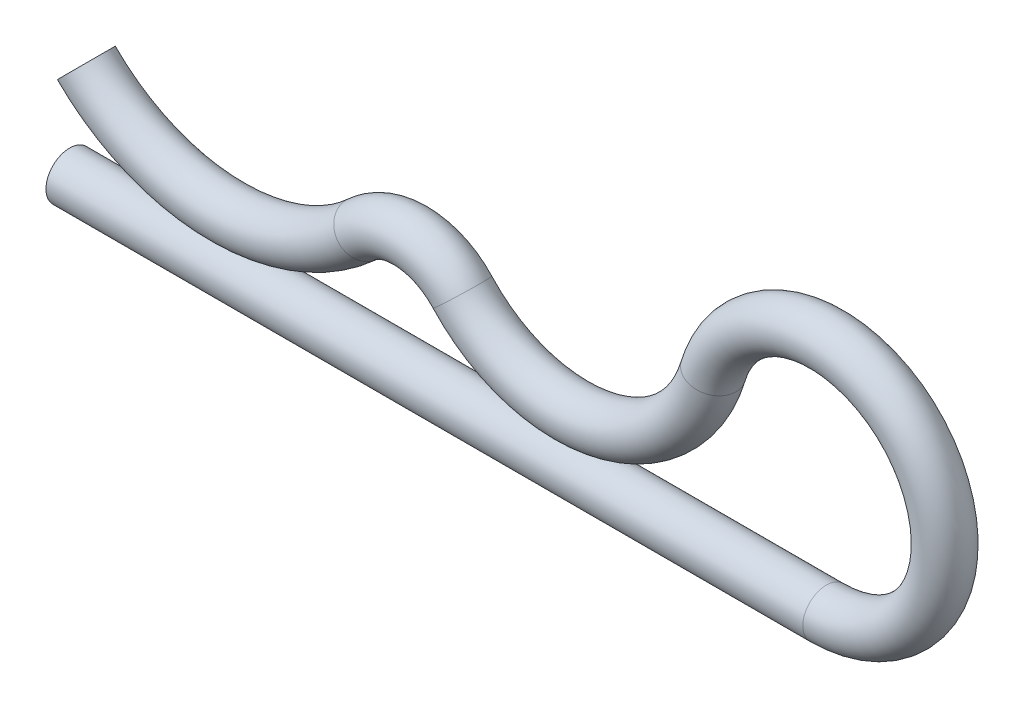
ISO-10303-21;
HEADER;
FILE_DESCRIPTION(('STEP AP214'),'2;1');
FILE_NAME('part.step','',(''),(''),'','','');
FILE_SCHEMA(('AUTOMOTIVE_DESIGN { 1 0 10303 214 1 1 1 1 }'));
ENDSEC;
DATA;
#1=APPLICATION_CONTEXT('core data for automotive mechanical design processes');
#2=APPLICATION_PROTOCOL_DEFINITION('international standard','automotive_design',2000,#1);
#3=PRODUCT_CONTEXT('',#1,'mechanical');
#4=PRODUCT('Part','Part','',(#3));
#5=PRODUCT_RELATED_PRODUCT_CATEGORY('part','',(#4));
#6=PRODUCT_DEFINITION_FORMATION('','',#4);
#7=PRODUCT_DEFINITION_CONTEXT('part definition',#1,'design');
#8=PRODUCT_DEFINITION('design','',#6,#7);
#9=PRODUCT_DEFINITION_SHAPE('','',#8);
#10=(LENGTH_UNIT() NAMED_UNIT(*) SI_UNIT(.MILLI.,.METRE.));
#11=(NAMED_UNIT(*) PLANE_ANGLE_UNIT() SI_UNIT($,.RADIAN.));
#12=(NAMED_UNIT(*) SI_UNIT($,.STERADIAN.) SOLID_ANGLE_UNIT());
#13=UNCERTAINTY_MEASURE_WITH_UNIT(LENGTH_MEASURE(1.E-05),#10,'distance_accuracy_value','');
#14=(GEOMETRIC_REPRESENTATION_CONTEXT(3) GLOBAL_UNCERTAINTY_ASSIGNED_CONTEXT((#13)) GLOBAL_UNIT_ASSIGNED_CONTEXT((#10,
#11,#12)) REPRESENTATION_CONTEXT('',''));
#15=CARTESIAN_POINT('',(0.,0.,0.));
#16=DIRECTION('',(0.,0.,1.));
#17=DIRECTION('',(1.,0.,0.));
#18=AXIS2_PLACEMENT_3D('',#15,#16,#17);
#19=CARTESIAN_POINT('',(2.64974375078576,4.14417854917457,0.));
#20=DIRECTION('',(0.,0.,-1.));
#21=DIRECTION('',(-1.,0.,0.));
#22=AXIS2_PLACEMENT_3D('',#19,#20,#21);
#23=TOROIDAL_SURFACE('',#22,3.35042854917457,0.396875);
#24=CARTESIAN_POINT('',(4.91131629924642,1.67220341354453,0.));
#25=DIRECTION('',(-0.737808641297245,-0.675009932391452,0.));
#26=DIRECTION('',(0.,0.,-1.));
#27=AXIS2_PLACEMENT_3D('',#24,#25,#26);
#28=CIRCLE('',#27,0.396875);
#29=CARTESIAN_POINT('',(5.17921086616427,1.37938560902967,0.));
#30=VERTEX_POINT('',#29);
#31=EDGE_CURVE('E37',#30,#30,#28,.T.);
#32=CARTESIAN_POINT('',(0.280633003783391,1.77506780217225,0.));
#33=DIRECTION('',(-0.707106781186557,0.707106781186538,0.));
#34=DIRECTION('',(0.,0.,-1.));
#35=AXIS2_PLACEMENT_3D('',#32,#33,#34);
#36=CIRCLE('',#35,0.396875);
#37=CARTESIAN_POINT('',(0.,1.49443479838884,0.));
#38=VERTEX_POINT('',#37);
#39=EDGE_CURVE('E10',#38,#38,#36,.T.);
#40=CARTESIAN_POINT('',(2.64974375078576,4.14417854917457,0.));
#41=DIRECTION('',(0.,0.,-1.));
#42=DIRECTION('',(-1.,0.,0.));
#43=AXIS2_PLACEMENT_3D('',#40,#41,#42);
#44=CIRCLE('',#43,3.74730354917457);
#45=EDGE_CURVE('',#30,#38,#44,.T.);
#46=ORIENTED_EDGE('',*,*,#31,.T.);
#47=ORIENTED_EDGE('',*,*,#39,.F.);
#48=ORIENTED_EDGE('',*,*,#45,.T.);
#49=ORIENTED_EDGE('',*,*,#45,.F.);
#50=EDGE_LOOP('',(#46,#48,#47,#49));
#51=FACE_BOUND('',#50,.T.);
#52=ADVANCED_FACE('F31',(#51),#23,.T.);
#53=CARTESIAN_POINT('',(5.715,0.79375,0.));
#54=DIRECTION('',(0.,0.,1.));
#55=DIRECTION('',(1.,0.,0.));
#56=AXIS2_PLACEMENT_3D('',#53,#54,#55);
#57=TOROIDAL_SURFACE('',#56,1.190625,0.396875);
#58=CARTESIAN_POINT('',(6.59238539863531,1.59859952189,0.));
#59=DIRECTION('',(-0.675989099750125,0.736911620901052,0.));
#60=DIRECTION('',(0.,0.,-1.));
#61=AXIS2_PLACEMENT_3D('',#58,#59,#60);
#62=CIRCLE('',#61,0.396875);
#63=CARTESIAN_POINT('',(6.2999235990902,1.33031634792668,0.));
#64=VERTEX_POINT('',#63);
#65=EDGE_CURVE('E41',#64,#64,#62,.T.);
#66=ORIENTED_EDGE('',*,*,#65,.T.);
#67=EDGE_LOOP('',(#66));
#68=FACE_BOUND('',#67,.T.);
#69=ORIENTED_EDGE('',*,*,#31,.F.);
#70=EDGE_LOOP('',(#69));
#71=FACE_BOUND('',#70,.T.);
#72=ADVANCED_FACE('F75',(#68,#71),#57,.T.);
#73=CARTESIAN_POINT('',(8.42288852461032,3.27776989337166,0.));
#74=DIRECTION('',(0.,0.,-1.));
#75=DIRECTION('',(-1.,0.,0.));
#76=AXIS2_PLACEMENT_3D('',#73,#74,#75);
#77=TOROIDAL_SURFACE('',#76,2.48401989337166,0.396875);
#78=CARTESIAN_POINT('',(10.8005722890413,2.55876033361084,0.));
#79=DIRECTION('',(-0.289454026386566,-0.957191917333512,0.));
#80=DIRECTION('',(0.,0.,-1.));
#81=AXIS2_PLACEMENT_3D('',#78,#79,#80);
#82=CIRCLE('',#81,0.396875);
#83=CARTESIAN_POINT('',(11.180457831233,2.44388326688866,0.));
#84=VERTEX_POINT('',#83);
#85=EDGE_CURVE('E45',#84,#84,#82,.T.);
#86=CARTESIAN_POINT('',(8.42288852461032,3.27776989337166,0.));
#87=DIRECTION('',(0.,0.,-1.));
#88=DIRECTION('',(-1.,0.,0.));
#89=AXIS2_PLACEMENT_3D('',#86,#87,#88);
#90=CIRCLE('',#89,2.88089489337166);
#91=EDGE_CURVE('',#84,#64,#90,.T.);
#92=ORIENTED_EDGE('',*,*,#85,.T.);
#93=ORIENTED_EDGE('',*,*,#65,.F.);
#94=ORIENTED_EDGE('',*,*,#91,.T.);
#95=ORIENTED_EDGE('',*,*,#91,.F.);
#96=EDGE_LOOP('',(#92,#94,#93,#95));
#97=FACE_BOUND('',#96,.T.);
#98=ADVANCED_FACE('F79',(#97),#77,.T.);
#99=CARTESIAN_POINT('',(12.7,1.984375,0.));
#100=DIRECTION('',(0.,0.,1.));
#101=DIRECTION('',(1.,0.,0.));
#102=AXIS2_PLACEMENT_3D('',#99,#100,#101);
#103=TOROIDAL_SURFACE('',#102,1.984375,0.396875);
#104=CARTESIAN_POINT('',(12.7,0.,0.));
#105=DIRECTION('',(1.,0.,0.));
#106=DIRECTION('',(0.,0.,-1.));
#107=AXIS2_PLACEMENT_3D('',#104,#105,#106);
#108=CIRCLE('',#107,0.396875);
#109=CARTESIAN_POINT('',(12.7,0.,-0.396875));
#110=VERTEX_POINT('',#109);
#111=EDGE_CURVE('E50',#110,#110,#108,.T.);
#112=ORIENTED_EDGE('',*,*,#111,.T.);
#113=EDGE_LOOP('',(#112));
#114=FACE_BOUND('',#113,.T.);
#115=ORIENTED_EDGE('',*,*,#85,.F.);
#116=EDGE_LOOP('',(#115));
#117=FACE_BOUND('',#116,.T.);
#118=ADVANCED_FACE('F57',(#114,#117),#103,.T.);
#119=CARTESIAN_POINT('',(12.7,0.,0.));
#120=DIRECTION('',(-1.,0.,0.));
#121=DIRECTION('',(0.,0.,1.));
#122=AXIS2_PLACEMENT_3D('',#119,#120,#121);
#123=CYLINDRICAL_SURFACE('',#122,0.396875);
#124=ORIENTED_EDGE('',*,*,#111,.F.);
#125=EDGE_LOOP('',(#124));
#126=FACE_BOUND('',#125,.T.);
#127=CARTESIAN_POINT('',(0.,0.,0.));
#128=DIRECTION('',(1.,0.,0.));
#129=DIRECTION('',(0.,0.,-1.));
#130=AXIS2_PLACEMENT_3D('',#127,#128,#129);
#131=CIRCLE('',#130,0.396875);
#132=CARTESIAN_POINT('',(0.,0.,-0.396875));
#133=VERTEX_POINT('',#132);
#134=EDGE_CURVE('E51',#133,#133,#131,.T.);
#135=ORIENTED_EDGE('',*,*,#134,.T.);
#136=EDGE_LOOP('',(#135));
#137=FACE_BOUND('',#136,.T.);
#138=ADVANCED_FACE('F60',(#126,#137),#123,.T.);
#139=CARTESIAN_POINT('',(0.280633003783391,1.77506780217225,0.));
#140=DIRECTION('',(-0.707106781186557,0.707106781186538,0.));
#141=DIRECTION('',(0.,0.,-1.));
#142=AXIS2_PLACEMENT_3D('',#139,#140,#141);
#143=PLANE('',#142);
#144=ORIENTED_EDGE('',*,*,#39,.T.);
#145=EDGE_LOOP('',(#144));
#146=FACE_BOUND('',#145,.T.);
#147=ADVANCED_FACE('F63',(#146),#143,.T.);
#148=CARTESIAN_POINT('',(0.,0.,0.));
#149=DIRECTION('',(1.,0.,0.));
#150=DIRECTION('',(0.,0.,-1.));
#151=AXIS2_PLACEMENT_3D('',#148,#149,#150);
#152=PLANE('',#151);
#153=ORIENTED_EDGE('',*,*,#134,.F.);
#154=EDGE_LOOP('',(#153));
#155=FACE_BOUND('',#154,.T.);
#156=ADVANCED_FACE('F67',(#155),#152,.F.);
#157=CLOSED_SHELL('',(#52,#72,#98,#118,#138,#147,#156));
#158=MANIFOLD_SOLID_BREP('B2',#157);
#159=ADVANCED_BREP_SHAPE_REPRESENTATION('',(#18,#158),#14);
#160=SHAPE_DEFINITION_REPRESENTATION(#9,#159);
ENDSEC;
END-ISO-10303-21;
